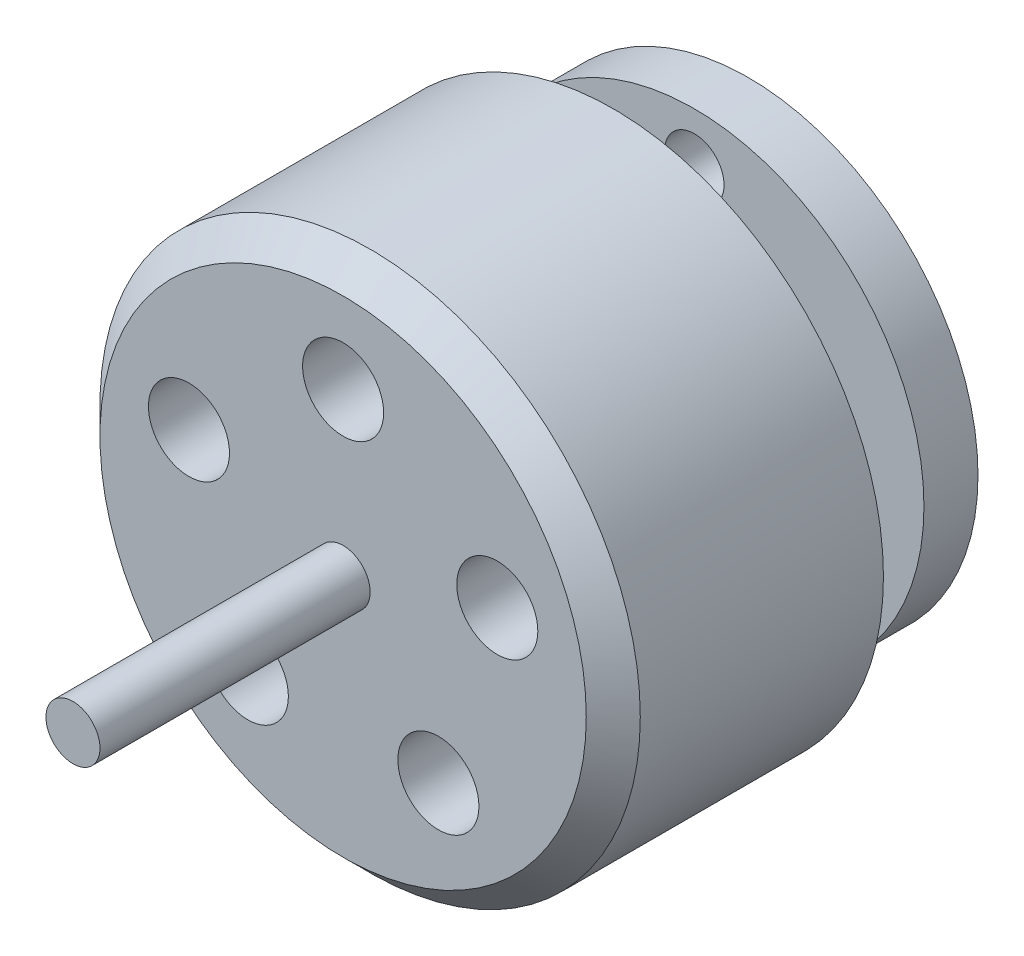
ISO-10303-21;
HEADER;
FILE_DESCRIPTION(('STEP AP214'),'2;1');
FILE_NAME('part.step','',(''),(''),'','','');
FILE_SCHEMA(('AUTOMOTIVE_DESIGN { 1 0 10303 214 1 1 1 1 }'));
ENDSEC;
DATA;
#1=APPLICATION_CONTEXT('core data for automotive mechanical design processes');
#2=APPLICATION_PROTOCOL_DEFINITION('international standard','automotive_design',2000,#1);
#3=PRODUCT_CONTEXT('',#1,'mechanical');
#4=PRODUCT('Part','Part','',(#3));
#5=PRODUCT_RELATED_PRODUCT_CATEGORY('part','',(#4));
#6=PRODUCT_DEFINITION_FORMATION('','',#4);
#7=PRODUCT_DEFINITION_CONTEXT('part definition',#1,'design');
#8=PRODUCT_DEFINITION('design','',#6,#7);
#9=PRODUCT_DEFINITION_SHAPE('','',#8);
#10=(LENGTH_UNIT() NAMED_UNIT(*) SI_UNIT(.MILLI.,.METRE.));
#11=(NAMED_UNIT(*) PLANE_ANGLE_UNIT() SI_UNIT($,.RADIAN.));
#12=(NAMED_UNIT(*) SI_UNIT($,.STERADIAN.) SOLID_ANGLE_UNIT());
#13=UNCERTAINTY_MEASURE_WITH_UNIT(LENGTH_MEASURE(1.E-05),#10,'distance_accuracy_value','');
#14=(GEOMETRIC_REPRESENTATION_CONTEXT(3) GLOBAL_UNCERTAINTY_ASSIGNED_CONTEXT((#13)) GLOBAL_UNIT_ASSIGNED_CONTEXT((#10,
#11,#12)) REPRESENTATION_CONTEXT('',''));
#15=CARTESIAN_POINT('',(0.,0.,0.));
#16=DIRECTION('',(0.,0.,1.));
#17=DIRECTION('',(1.,0.,0.));
#18=AXIS2_PLACEMENT_3D('',#15,#16,#17);
#19=CARTESIAN_POINT('',(0.,0.,1.));
#20=DIRECTION('',(0.,0.,1.));
#21=DIRECTION('',(1.,0.,0.));
#22=AXIS2_PLACEMENT_3D('',#19,#20,#21);
#23=PLANE('',#22);
#24=CARTESIAN_POINT('',(0.,0.,1.));
#25=DIRECTION('',(0.,0.,1.));
#26=DIRECTION('',(1.,0.,0.));
#27=AXIS2_PLACEMENT_3D('',#24,#25,#26);
#28=CIRCLE('',#27,1.5);
#29=CARTESIAN_POINT('',(1.5,0.,1.));
#30=VERTEX_POINT('',#29);
#31=EDGE_CURVE('E87',#30,#30,#28,.T.);
#32=ORIENTED_EDGE('',*,*,#31,.F.);
#33=EDGE_LOOP('',(#32));
#34=FACE_BOUND('',#33,.T.);
#35=CARTESIAN_POINT('',(2.85788383248886,-1.64999999999988,1.));
#36=DIRECTION('',(0.,0.,1.));
#37=DIRECTION('',(1.,0.,0.));
#38=AXIS2_PLACEMENT_3D('',#35,#36,#37);
#39=CIRCLE('',#38,0.550000000000182);
#40=CARTESIAN_POINT('',(3.40788383248904,-1.64999999999988,1.));
#41=VERTEX_POINT('',#40);
#42=EDGE_CURVE('E67',#41,#41,#39,.T.);
#43=ORIENTED_EDGE('',*,*,#42,.F.);
#44=EDGE_LOOP('',(#43));
#45=FACE_BOUND('',#44,.T.);
#46=CARTESIAN_POINT('',(0.,0.,1.));
#47=DIRECTION('',(0.,0.,1.));
#48=DIRECTION('',(1.,0.,0.));
#49=AXIS2_PLACEMENT_3D('',#46,#47,#48);
#50=CIRCLE('',#49,4.25);
#51=CARTESIAN_POINT('',(4.25,0.,1.));
#52=VERTEX_POINT('',#51);
#53=EDGE_CURVE('E51',#52,#52,#50,.T.);
#54=ORIENTED_EDGE('',*,*,#53,.T.);
#55=EDGE_LOOP('',(#54));
#56=FACE_BOUND('',#55,.T.);
#57=CARTESIAN_POINT('',(0.,3.3,1.));
#58=DIRECTION('',(0.,0.,1.));
#59=DIRECTION('',(1.,0.,0.));
#60=AXIS2_PLACEMENT_3D('',#57,#58,#59);
#61=CIRCLE('',#60,0.55);
#62=CARTESIAN_POINT('',(0.55,3.3,1.));
#63=VERTEX_POINT('',#62);
#64=EDGE_CURVE('E61',#63,#63,#61,.T.);
#65=ORIENTED_EDGE('',*,*,#64,.F.);
#66=EDGE_LOOP('',(#65));
#67=FACE_BOUND('',#66,.T.);
#68=CARTESIAN_POINT('',(-2.85788383248844,-1.65000000000012,1.));
#69=DIRECTION('',(0.,0.,1.));
#70=DIRECTION('',(1.,0.,0.));
#71=AXIS2_PLACEMENT_3D('',#68,#69,#70);
#72=CIRCLE('',#71,0.550000000000267);
#73=CARTESIAN_POINT('',(-2.30788383248817,-1.65000000000012,1.));
#74=VERTEX_POINT('',#73);
#75=EDGE_CURVE('E75',#74,#74,#72,.T.);
#76=ORIENTED_EDGE('',*,*,#75,.F.);
#77=EDGE_LOOP('',(#76));
#78=FACE_BOUND('',#77,.T.);
#79=ADVANCED_FACE('F38',(#34,#45,#56,#67,#78),#23,.T.);
#80=CARTESIAN_POINT('',(0.,0.,0.));
#81=DIRECTION('',(0.,0.,1.));
#82=DIRECTION('',(1.,0.,0.));
#83=AXIS2_PLACEMENT_3D('',#80,#81,#82);
#84=PLANE('',#83);
#85=CARTESIAN_POINT('',(0.,0.,0.));
#86=DIRECTION('',(0.,0.,1.));
#87=DIRECTION('',(1.,0.,0.));
#88=AXIS2_PLACEMENT_3D('',#85,#86,#87);
#89=CIRCLE('',#88,4.25);
#90=CARTESIAN_POINT('',(4.25,0.,0.));
#91=VERTEX_POINT('',#90);
#92=EDGE_CURVE('E56',#91,#91,#89,.T.);
#93=ORIENTED_EDGE('',*,*,#92,.F.);
#94=EDGE_LOOP('',(#93));
#95=FACE_BOUND('',#94,.T.);
#96=CARTESIAN_POINT('',(0.,3.3,0.));
#97=DIRECTION('',(0.,0.,1.));
#98=DIRECTION('',(1.,0.,0.));
#99=AXIS2_PLACEMENT_3D('',#96,#97,#98);
#100=CIRCLE('',#99,0.55);
#101=CARTESIAN_POINT('',(0.55,3.3,0.));
#102=VERTEX_POINT('',#101);
#103=EDGE_CURVE('E63',#102,#102,#100,.T.);
#104=ORIENTED_EDGE('',*,*,#103,.T.);
#105=EDGE_LOOP('',(#104));
#106=FACE_BOUND('',#105,.T.);
#107=CARTESIAN_POINT('',(2.85788383248886,-1.64999999999988,0.));
#108=DIRECTION('',(0.,0.,1.));
#109=DIRECTION('',(1.,0.,0.));
#110=AXIS2_PLACEMENT_3D('',#107,#108,#109);
#111=CIRCLE('',#110,0.550000000000182);
#112=CARTESIAN_POINT('',(3.40788383248904,-1.64999999999988,0.));
#113=VERTEX_POINT('',#112);
#114=EDGE_CURVE('E71',#113,#113,#111,.T.);
#115=ORIENTED_EDGE('',*,*,#114,.T.);
#116=EDGE_LOOP('',(#115));
#117=FACE_BOUND('',#116,.T.);
#118=CARTESIAN_POINT('',(-2.85788383248844,-1.65000000000012,0.));
#119=DIRECTION('',(0.,0.,1.));
#120=DIRECTION('',(1.,0.,0.));
#121=AXIS2_PLACEMENT_3D('',#118,#119,#120);
#122=CIRCLE('',#121,0.550000000000267);
#123=CARTESIAN_POINT('',(-2.30788383248817,-1.65000000000012,0.));
#124=VERTEX_POINT('',#123);
#125=EDGE_CURVE('E79',#124,#124,#122,.T.);
#126=ORIENTED_EDGE('',*,*,#125,.T.);
#127=EDGE_LOOP('',(#126));
#128=FACE_BOUND('',#127,.T.);
#129=ADVANCED_FACE('F188',(#95,#106,#117,#128),#84,.F.);
#130=CARTESIAN_POINT('',(0.,0.,1.));
#131=DIRECTION('',(0.,0.,-1.));
#132=DIRECTION('',(-1.,0.,0.));
#133=AXIS2_PLACEMENT_3D('',#130,#131,#132);
#134=CYLINDRICAL_SURFACE('',#133,4.25);
#135=ORIENTED_EDGE('',*,*,#53,.F.);
#136=EDGE_LOOP('',(#135));
#137=FACE_BOUND('',#136,.T.);
#138=ORIENTED_EDGE('',*,*,#92,.T.);
#139=EDGE_LOOP('',(#138));
#140=FACE_BOUND('',#139,.T.);
#141=ADVANCED_FACE('F194',(#137,#140),#134,.T.);
#142=CARTESIAN_POINT('',(0.,3.3,1.));
#143=DIRECTION('',(0.,0.,-1.));
#144=DIRECTION('',(-1.,0.,0.));
#145=AXIS2_PLACEMENT_3D('',#142,#143,#144);
#146=CYLINDRICAL_SURFACE('',#145,0.55);
#147=ORIENTED_EDGE('',*,*,#64,.T.);
#148=EDGE_LOOP('',(#147));
#149=FACE_BOUND('',#148,.T.);
#150=ORIENTED_EDGE('',*,*,#103,.F.);
#151=EDGE_LOOP('',(#150));
#152=FACE_BOUND('',#151,.T.);
#153=ADVANCED_FACE('F200',(#149,#152),#146,.F.);
#154=CARTESIAN_POINT('',(2.85788383248886,-1.64999999999988,1.));
#155=DIRECTION('',(0.,0.,-1.));
#156=DIRECTION('',(-1.,0.,0.));
#157=AXIS2_PLACEMENT_3D('',#154,#155,#156);
#158=CYLINDRICAL_SURFACE('',#157,0.550000000000182);
#159=ORIENTED_EDGE('',*,*,#42,.T.);
#160=EDGE_LOOP('',(#159));
#161=FACE_BOUND('',#160,.T.);
#162=ORIENTED_EDGE('',*,*,#114,.F.);
#163=EDGE_LOOP('',(#162));
#164=FACE_BOUND('',#163,.T.);
#165=ADVANCED_FACE('F207',(#161,#164),#158,.F.);
#166=CARTESIAN_POINT('',(-2.85788383248844,-1.65000000000012,1.));
#167=DIRECTION('',(0.,0.,-1.));
#168=DIRECTION('',(-1.,0.,0.));
#169=AXIS2_PLACEMENT_3D('',#166,#167,#168);
#170=CYLINDRICAL_SURFACE('',#169,0.550000000000267);
#171=ORIENTED_EDGE('',*,*,#75,.T.);
#172=EDGE_LOOP('',(#171));
#173=FACE_BOUND('',#172,.T.);
#174=ORIENTED_EDGE('',*,*,#125,.F.);
#175=EDGE_LOOP('',(#174));
#176=FACE_BOUND('',#175,.T.);
#177=ADVANCED_FACE('F219',(#173,#176),#170,.F.);
#178=CARTESIAN_POINT('',(0.,0.,2.5));
#179=DIRECTION('',(0.,0.,-1.));
#180=DIRECTION('',(-1.,0.,0.));
#181=AXIS2_PLACEMENT_3D('',#178,#179,#180);
#182=CYLINDRICAL_SURFACE('',#181,1.5);
#183=CARTESIAN_POINT('',(0.,0.,2.5));
#184=DIRECTION('',(0.,0.,1.));
#185=DIRECTION('',(1.,0.,0.));
#186=AXIS2_PLACEMENT_3D('',#183,#184,#185);
#187=CIRCLE('',#186,1.5);
#188=CARTESIAN_POINT('',(1.5,0.,2.5));
#189=VERTEX_POINT('',#188);
#190=EDGE_CURVE('E83',#189,#189,#187,.T.);
#191=ORIENTED_EDGE('',*,*,#190,.F.);
#192=EDGE_LOOP('',(#191));
#193=FACE_BOUND('',#192,.T.);
#194=ORIENTED_EDGE('',*,*,#31,.T.);
#195=EDGE_LOOP('',(#194));
#196=FACE_BOUND('',#195,.T.);
#197=ADVANCED_FACE('F221',(#193,#196),#182,.T.);
#198=CARTESIAN_POINT('',(0.,0.,7.5));
#199=DIRECTION('',(0.,0.,-1.));
#200=DIRECTION('',(-1.,0.,0.));
#201=AXIS2_PLACEMENT_3D('',#198,#199,#200);
#202=CYLINDRICAL_SURFACE('',#201,5.);
#203=CARTESIAN_POINT('',(0.,0.,7.));
#204=DIRECTION('',(0.,0.,1.));
#205=DIRECTION('',(1.,0.,0.));
#206=AXIS2_PLACEMENT_3D('',#203,#204,#205);
#207=CIRCLE('',#206,5.);
#208=CARTESIAN_POINT('',(5.,0.,7.));
#209=VERTEX_POINT('',#208);
#210=EDGE_CURVE('E10',#209,#209,#207,.F.);
#211=ORIENTED_EDGE('',*,*,#210,.T.);
#212=EDGE_LOOP('',(#211));
#213=FACE_BOUND('',#212,.T.);
#214=CARTESIAN_POINT('',(0.,0.,2.5));
#215=DIRECTION('',(0.,0.,1.));
#216=DIRECTION('',(1.,0.,0.));
#217=AXIS2_PLACEMENT_3D('',#214,#215,#216);
#218=CIRCLE('',#217,5.);
#219=CARTESIAN_POINT('',(5.,0.,2.5));
#220=VERTEX_POINT('',#219);
#221=EDGE_CURVE('E91',#220,#220,#218,.T.);
#222=ORIENTED_EDGE('',*,*,#221,.T.);
#223=EDGE_LOOP('',(#222));
#224=FACE_BOUND('',#223,.T.);
#225=ADVANCED_FACE('F160',(#213,#224),#202,.T.);
#226=CARTESIAN_POINT('',(0.,0.,7.5));
#227=DIRECTION('',(0.,0.,1.));
#228=DIRECTION('',(1.,0.,0.));
#229=AXIS2_PLACEMENT_3D('',#226,#227,#228);
#230=PLANE('',#229);
#231=CARTESIAN_POINT('',(0.,0.,7.5));
#232=DIRECTION('',(0.,0.,1.));
#233=DIRECTION('',(1.,0.,0.));
#234=AXIS2_PLACEMENT_3D('',#231,#232,#233);
#235=CIRCLE('',#234,4.5);
#236=CARTESIAN_POINT('',(4.5,0.,7.5));
#237=VERTEX_POINT('',#236);
#238=EDGE_CURVE('E46',#237,#237,#235,.T.);
#239=ORIENTED_EDGE('',*,*,#238,.T.);
#240=EDGE_LOOP('',(#239));
#241=FACE_BOUND('',#240,.T.);
#242=CARTESIAN_POINT('',(0.,3.,7.5));
#243=DIRECTION('',(0.,0.,1.));
#244=DIRECTION('',(1.,0.,0.));
#245=AXIS2_PLACEMENT_3D('',#242,#243,#244);
#246=CIRCLE('',#245,0.75);
#247=CARTESIAN_POINT('',(0.75,3.,7.5));
#248=VERTEX_POINT('',#247);
#249=EDGE_CURVE('E139',#248,#248,#246,.T.);
#250=ORIENTED_EDGE('',*,*,#249,.F.);
#251=EDGE_LOOP('',(#250));
#252=FACE_BOUND('',#251,.T.);
#253=CARTESIAN_POINT('',(2.85316954888546,0.927050983124843,7.5));
#254=DIRECTION('',(0.,0.,1.));
#255=DIRECTION('',(1.,0.,0.));
#256=AXIS2_PLACEMENT_3D('',#253,#254,#255);
#257=CIRCLE('',#256,0.750000000000113);
#258=CARTESIAN_POINT('',(3.60316954888557,0.927050983124843,7.5));
#259=VERTEX_POINT('',#258);
#260=EDGE_CURVE('E131',#259,#259,#257,.T.);
#261=ORIENTED_EDGE('',*,*,#260,.F.);
#262=EDGE_LOOP('',(#261));
#263=FACE_BOUND('',#262,.T.);
#264=CARTESIAN_POINT('',(1.76335575687742,-2.42705098312484,7.5));
#265=DIRECTION('',(0.,0.,1.));
#266=DIRECTION('',(1.,0.,0.));
#267=AXIS2_PLACEMENT_3D('',#264,#265,#266);
#268=CIRCLE('',#267,0.750000000000226);
#269=CARTESIAN_POINT('',(2.51335575687765,-2.42705098312484,7.5));
#270=VERTEX_POINT('',#269);
#271=EDGE_CURVE('E123',#270,#270,#268,.T.);
#272=ORIENTED_EDGE('',*,*,#271,.F.);
#273=EDGE_LOOP('',(#272));
#274=FACE_BOUND('',#273,.T.);
#275=CARTESIAN_POINT('',(-1.76335575687742,-2.42705098312484,7.5));
#276=DIRECTION('',(0.,0.,1.));
#277=DIRECTION('',(1.,0.,0.));
#278=AXIS2_PLACEMENT_3D('',#275,#276,#277);
#279=CIRCLE('',#278,0.750000000000185);
#280=CARTESIAN_POINT('',(-1.01335575687723,-2.42705098312484,7.5));
#281=VERTEX_POINT('',#280);
#282=EDGE_CURVE('E115',#281,#281,#279,.T.);
#283=ORIENTED_EDGE('',*,*,#282,.F.);
#284=EDGE_LOOP('',(#283));
#285=FACE_BOUND('',#284,.T.);
#286=CARTESIAN_POINT('',(-2.85316954888546,0.927050983124842,7.5));
#287=DIRECTION('',(0.,0.,1.));
#288=DIRECTION('',(1.,0.,0.));
#289=AXIS2_PLACEMENT_3D('',#286,#287,#288);
#290=CIRCLE('',#289,0.750000000000045);
#291=CARTESIAN_POINT('',(-2.10316954888542,0.927050983124842,7.5));
#292=VERTEX_POINT('',#291);
#293=EDGE_CURVE('E107',#292,#292,#290,.T.);
#294=ORIENTED_EDGE('',*,*,#293,.F.);
#295=EDGE_LOOP('',(#294));
#296=FACE_BOUND('',#295,.T.);
#297=CARTESIAN_POINT('',(0.,0.,7.5));
#298=DIRECTION('',(0.,0.,1.));
#299=DIRECTION('',(1.,0.,0.));
#300=AXIS2_PLACEMENT_3D('',#297,#298,#299);
#301=CIRCLE('',#300,0.5);
#302=CARTESIAN_POINT('',(0.5,0.,7.5));
#303=VERTEX_POINT('',#302);
#304=EDGE_CURVE('E99',#303,#303,#301,.T.);
#305=ORIENTED_EDGE('',*,*,#304,.F.);
#306=EDGE_LOOP('',(#305));
#307=FACE_BOUND('',#306,.T.);
#308=ADVANCED_FACE('F156',(#241,#252,#263,#274,#285,#296,#307),#230,.T.);
#309=CARTESIAN_POINT('',(0.,0.,2.5));
#310=DIRECTION('',(0.,0.,1.));
#311=DIRECTION('',(1.,0.,0.));
#312=AXIS2_PLACEMENT_3D('',#309,#310,#311);
#313=PLANE('',#312);
#314=ORIENTED_EDGE('',*,*,#190,.T.);
#315=EDGE_LOOP('',(#314));
#316=FACE_BOUND('',#315,.T.);
#317=ORIENTED_EDGE('',*,*,#221,.F.);
#318=EDGE_LOOP('',(#317));
#319=FACE_BOUND('',#318,.T.);
#320=ADVANCED_FACE('F159',(#316,#319),#313,.F.);
#321=CARTESIAN_POINT('',(0.,0.,12.5));
#322=DIRECTION('',(0.,0.,-1.));
#323=DIRECTION('',(-1.,0.,0.));
#324=AXIS2_PLACEMENT_3D('',#321,#322,#323);
#325=CYLINDRICAL_SURFACE('',#324,0.5);
#326=CARTESIAN_POINT('',(0.,0.,12.5));
#327=DIRECTION('',(0.,0.,1.));
#328=DIRECTION('',(1.,0.,0.));
#329=AXIS2_PLACEMENT_3D('',#326,#327,#328);
#330=CIRCLE('',#329,0.5);
#331=CARTESIAN_POINT('',(0.5,0.,12.5));
#332=VERTEX_POINT('',#331);
#333=EDGE_CURVE('E98',#332,#332,#330,.T.);
#334=ORIENTED_EDGE('',*,*,#333,.F.);
#335=EDGE_LOOP('',(#334));
#336=FACE_BOUND('',#335,.T.);
#337=ORIENTED_EDGE('',*,*,#304,.T.);
#338=EDGE_LOOP('',(#337));
#339=FACE_BOUND('',#338,.T.);
#340=ADVANCED_FACE('F172',(#336,#339),#325,.T.);
#341=CARTESIAN_POINT('',(0.,0.,12.5));
#342=DIRECTION('',(0.,0.,1.));
#343=DIRECTION('',(1.,0.,0.));
#344=AXIS2_PLACEMENT_3D('',#341,#342,#343);
#345=PLANE('',#344);
#346=ORIENTED_EDGE('',*,*,#333,.T.);
#347=EDGE_LOOP('',(#346));
#348=FACE_BOUND('',#347,.T.);
#349=ADVANCED_FACE('F174',(#348),#345,.T.);
#350=CARTESIAN_POINT('',(-2.85316954888546,0.927050983124842,5.5));
#351=DIRECTION('',(0.,0.,1.));
#352=DIRECTION('',(1.,0.,0.));
#353=AXIS2_PLACEMENT_3D('',#350,#351,#352);
#354=CYLINDRICAL_SURFACE('',#353,0.750000000000045);
#355=CARTESIAN_POINT('',(-2.85316954888546,0.927050983124842,5.5));
#356=DIRECTION('',(0.,0.,1.));
#357=DIRECTION('',(1.,0.,0.));
#358=AXIS2_PLACEMENT_3D('',#355,#356,#357);
#359=CIRCLE('',#358,0.750000000000045);
#360=CARTESIAN_POINT('',(-2.10316954888542,0.927050983124842,5.5));
#361=VERTEX_POINT('',#360);
#362=EDGE_CURVE('E111',#361,#361,#359,.T.);
#363=ORIENTED_EDGE('',*,*,#362,.F.);
#364=EDGE_LOOP('',(#363));
#365=FACE_BOUND('',#364,.T.);
#366=ORIENTED_EDGE('',*,*,#293,.T.);
#367=EDGE_LOOP('',(#366));
#368=FACE_BOUND('',#367,.T.);
#369=ADVANCED_FACE('F181',(#365,#368),#354,.F.);
#370=CARTESIAN_POINT('',(-2.85316954888546,0.927050983124842,5.5));
#371=DIRECTION('',(0.,0.,1.));
#372=DIRECTION('',(1.,0.,0.));
#373=AXIS2_PLACEMENT_3D('',#370,#371,#372);
#374=PLANE('',#373);
#375=ORIENTED_EDGE('',*,*,#362,.T.);
#376=EDGE_LOOP('',(#375));
#377=FACE_BOUND('',#376,.T.);
#378=ADVANCED_FACE('F306',(#377),#374,.T.);
#379=CARTESIAN_POINT('',(-1.76335575687742,-2.42705098312484,5.5));
#380=DIRECTION('',(0.,0.,1.));
#381=DIRECTION('',(1.,0.,0.));
#382=AXIS2_PLACEMENT_3D('',#379,#380,#381);
#383=CYLINDRICAL_SURFACE('',#382,0.750000000000185);
#384=CARTESIAN_POINT('',(-1.76335575687742,-2.42705098312484,5.5));
#385=DIRECTION('',(0.,0.,1.));
#386=DIRECTION('',(1.,0.,0.));
#387=AXIS2_PLACEMENT_3D('',#384,#385,#386);
#388=CIRCLE('',#387,0.750000000000185);
#389=CARTESIAN_POINT('',(-1.01335575687723,-2.42705098312484,5.5));
#390=VERTEX_POINT('',#389);
#391=EDGE_CURVE('E119',#390,#390,#388,.T.);
#392=ORIENTED_EDGE('',*,*,#391,.F.);
#393=EDGE_LOOP('',(#392));
#394=FACE_BOUND('',#393,.T.);
#395=ORIENTED_EDGE('',*,*,#282,.T.);
#396=EDGE_LOOP('',(#395));
#397=FACE_BOUND('',#396,.T.);
#398=ADVANCED_FACE('F298',(#394,#397),#383,.F.);
#399=CARTESIAN_POINT('',(-1.76335575687742,-2.42705098312484,5.5));
#400=DIRECTION('',(0.,0.,1.));
#401=DIRECTION('',(1.,0.,0.));
#402=AXIS2_PLACEMENT_3D('',#399,#400,#401);
#403=PLANE('',#402);
#404=ORIENTED_EDGE('',*,*,#391,.T.);
#405=EDGE_LOOP('',(#404));
#406=FACE_BOUND('',#405,.T.);
#407=ADVANCED_FACE('F290',(#406),#403,.T.);
#408=CARTESIAN_POINT('',(1.76335575687742,-2.42705098312484,5.5));
#409=DIRECTION('',(0.,0.,1.));
#410=DIRECTION('',(1.,0.,0.));
#411=AXIS2_PLACEMENT_3D('',#408,#409,#410);
#412=CYLINDRICAL_SURFACE('',#411,0.750000000000226);
#413=CARTESIAN_POINT('',(1.76335575687742,-2.42705098312484,5.5));
#414=DIRECTION('',(0.,0.,1.));
#415=DIRECTION('',(1.,0.,0.));
#416=AXIS2_PLACEMENT_3D('',#413,#414,#415);
#417=CIRCLE('',#416,0.750000000000226);
#418=CARTESIAN_POINT('',(2.51335575687765,-2.42705098312484,5.5));
#419=VERTEX_POINT('',#418);
#420=EDGE_CURVE('E127',#419,#419,#417,.T.);
#421=ORIENTED_EDGE('',*,*,#420,.F.);
#422=EDGE_LOOP('',(#421));
#423=FACE_BOUND('',#422,.T.);
#424=ORIENTED_EDGE('',*,*,#271,.T.);
#425=EDGE_LOOP('',(#424));
#426=FACE_BOUND('',#425,.T.);
#427=ADVANCED_FACE('F282',(#423,#426),#412,.F.);
#428=CARTESIAN_POINT('',(1.76335575687742,-2.42705098312484,5.5));
#429=DIRECTION('',(0.,0.,1.));
#430=DIRECTION('',(1.,0.,0.));
#431=AXIS2_PLACEMENT_3D('',#428,#429,#430);
#432=PLANE('',#431);
#433=ORIENTED_EDGE('',*,*,#420,.T.);
#434=EDGE_LOOP('',(#433));
#435=FACE_BOUND('',#434,.T.);
#436=ADVANCED_FACE('F274',(#435),#432,.T.);
#437=CARTESIAN_POINT('',(2.85316954888546,0.927050983124843,5.5));
#438=DIRECTION('',(0.,0.,1.));
#439=DIRECTION('',(1.,0.,0.));
#440=AXIS2_PLACEMENT_3D('',#437,#438,#439);
#441=CYLINDRICAL_SURFACE('',#440,0.750000000000113);
#442=CARTESIAN_POINT('',(2.85316954888546,0.927050983124843,5.5));
#443=DIRECTION('',(0.,0.,1.));
#444=DIRECTION('',(1.,0.,0.));
#445=AXIS2_PLACEMENT_3D('',#442,#443,#444);
#446=CIRCLE('',#445,0.750000000000113);
#447=CARTESIAN_POINT('',(3.60316954888557,0.927050983124843,5.5));
#448=VERTEX_POINT('',#447);
#449=EDGE_CURVE('E135',#448,#448,#446,.T.);
#450=ORIENTED_EDGE('',*,*,#449,.F.);
#451=EDGE_LOOP('',(#450));
#452=FACE_BOUND('',#451,.T.);
#453=ORIENTED_EDGE('',*,*,#260,.T.);
#454=EDGE_LOOP('',(#453));
#455=FACE_BOUND('',#454,.T.);
#456=ADVANCED_FACE('F266',(#452,#455),#441,.F.);
#457=CARTESIAN_POINT('',(2.85316954888546,0.927050983124843,5.5));
#458=DIRECTION('',(0.,0.,1.));
#459=DIRECTION('',(1.,0.,0.));
#460=AXIS2_PLACEMENT_3D('',#457,#458,#459);
#461=PLANE('',#460);
#462=ORIENTED_EDGE('',*,*,#449,.T.);
#463=EDGE_LOOP('',(#462));
#464=FACE_BOUND('',#463,.T.);
#465=ADVANCED_FACE('F152',(#464),#461,.T.);
#466=CARTESIAN_POINT('',(0.,3.,5.5));
#467=DIRECTION('',(0.,0.,1.));
#468=DIRECTION('',(1.,0.,0.));
#469=AXIS2_PLACEMENT_3D('',#466,#467,#468);
#470=CYLINDRICAL_SURFACE('',#469,0.75);
#471=CARTESIAN_POINT('',(0.,3.,5.5));
#472=DIRECTION('',(0.,0.,1.));
#473=DIRECTION('',(1.,0.,0.));
#474=AXIS2_PLACEMENT_3D('',#471,#472,#473);
#475=CIRCLE('',#474,0.75);
#476=CARTESIAN_POINT('',(0.75,3.,5.5));
#477=VERTEX_POINT('',#476);
#478=EDGE_CURVE('E103',#477,#477,#475,.T.);
#479=ORIENTED_EDGE('',*,*,#478,.F.);
#480=EDGE_LOOP('',(#479));
#481=FACE_BOUND('',#480,.T.);
#482=ORIENTED_EDGE('',*,*,#249,.T.);
#483=EDGE_LOOP('',(#482));
#484=FACE_BOUND('',#483,.T.);
#485=ADVANCED_FACE('F149',(#481,#484),#470,.F.);
#486=CARTESIAN_POINT('',(0.,3.,5.5));
#487=DIRECTION('',(0.,0.,1.));
#488=DIRECTION('',(1.,0.,0.));
#489=AXIS2_PLACEMENT_3D('',#486,#487,#488);
#490=PLANE('',#489);
#491=ORIENTED_EDGE('',*,*,#478,.T.);
#492=EDGE_LOOP('',(#491));
#493=FACE_BOUND('',#492,.T.);
#494=ADVANCED_FACE('F147',(#493),#490,.T.);
#495=CARTESIAN_POINT('',(0.,0.,7.5));
#496=DIRECTION('',(0.,0.,-1.));
#497=DIRECTION('',(-1.,0.,0.));
#498=AXIS2_PLACEMENT_3D('',#495,#496,#497);
#499=CONICAL_SURFACE('',#498,4.5,0.785398163397447);
#500=ORIENTED_EDGE('',*,*,#210,.F.);
#501=EDGE_LOOP('',(#500));
#502=FACE_BOUND('',#501,.T.);
#503=ORIENTED_EDGE('',*,*,#238,.F.);
#504=EDGE_LOOP('',(#503));
#505=FACE_BOUND('',#504,.T.);
#506=ADVANCED_FACE('F40',(#502,#505),#499,.T.);
#507=CLOSED_SHELL('',(#79,#129,#141,#153,#165,#177,#197,#225,#308,#320,#340,#349,#369,#378,#398,
#407,#427,#436,#456,#465,#485,#494,#506));
#508=MANIFOLD_SOLID_BREP('B2',#507);
#509=ADVANCED_BREP_SHAPE_REPRESENTATION('',(#18,#508),#14);
#510=SHAPE_DEFINITION_REPRESENTATION(#9,#509);
ENDSEC;
END-ISO-10303-21;
